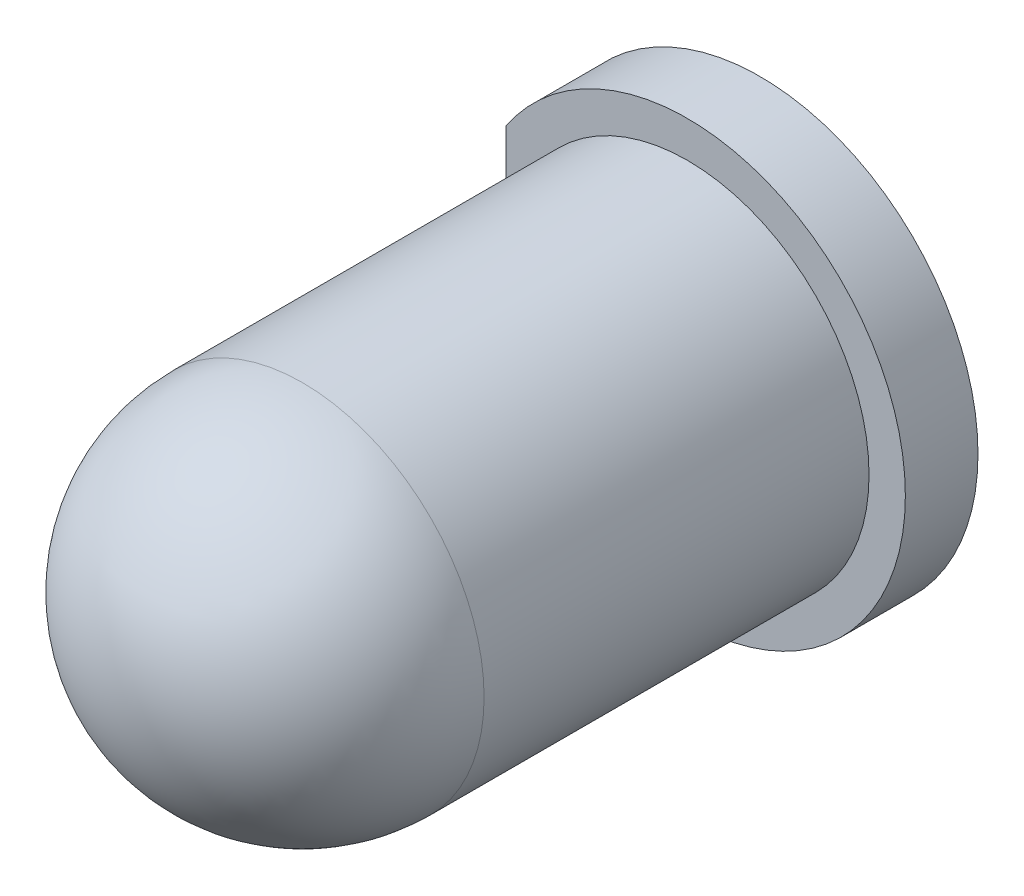
ISO-10303-21;
HEADER;
FILE_DESCRIPTION(('STEP AP214'),'2;1');
FILE_NAME('part.step','',(''),(''),'','','');
FILE_SCHEMA(('AUTOMOTIVE_DESIGN { 1 0 10303 214 1 1 1 1 }'));
ENDSEC;
DATA;
#1=APPLICATION_CONTEXT('core data for automotive mechanical design processes');
#2=APPLICATION_PROTOCOL_DEFINITION('international standard','automotive_design',2000,#1);
#3=PRODUCT_CONTEXT('',#1,'mechanical');
#4=PRODUCT('Part','Part','',(#3));
#5=PRODUCT_RELATED_PRODUCT_CATEGORY('part','',(#4));
#6=PRODUCT_DEFINITION_FORMATION('','',#4);
#7=PRODUCT_DEFINITION_CONTEXT('part definition',#1,'design');
#8=PRODUCT_DEFINITION('design','',#6,#7);
#9=PRODUCT_DEFINITION_SHAPE('','',#8);
#10=(LENGTH_UNIT() NAMED_UNIT(*) SI_UNIT(.MILLI.,.METRE.));
#11=(NAMED_UNIT(*) PLANE_ANGLE_UNIT() SI_UNIT($,.RADIAN.));
#12=(NAMED_UNIT(*) SI_UNIT($,.STERADIAN.) SOLID_ANGLE_UNIT());
#13=UNCERTAINTY_MEASURE_WITH_UNIT(LENGTH_MEASURE(1.E-05),#10,'distance_accuracy_value','');
#14=(GEOMETRIC_REPRESENTATION_CONTEXT(3) GLOBAL_UNCERTAINTY_ASSIGNED_CONTEXT((#13)) GLOBAL_UNIT_ASSIGNED_CONTEXT((#10,
#11,#12)) REPRESENTATION_CONTEXT('',''));
#15=CARTESIAN_POINT('',(0.,0.,0.));
#16=DIRECTION('',(0.,0.,1.));
#17=DIRECTION('',(1.,0.,0.));
#18=AXIS2_PLACEMENT_3D('',#15,#16,#17);
#19=CARTESIAN_POINT('',(-1.12,-0.24,0.));
#20=DIRECTION('',(1.,0.,0.));
#21=DIRECTION('',(0.,0.,-1.));
#22=AXIS2_PLACEMENT_3D('',#19,#20,#21);
#23=PLANE('',#22);
#24=DIRECTION('',(0.,1.,0.));
#25=VECTOR('',#24,1.);
#26=CARTESIAN_POINT('',(-1.12,-0.24,0.));
#27=LINE('',#26,#25);
#28=CARTESIAN_POINT('',(-1.12,-0.24,0.));
#29=VERTEX_POINT('',#28);
#30=CARTESIAN_POINT('',(-1.12,0.24,0.));
#31=VERTEX_POINT('',#30);
#32=EDGE_CURVE('E249',#29,#31,#27,.T.);
#33=ORIENTED_EDGE('',*,*,#32,.F.);
#34=DIRECTION('',(0.,0.,-1.));
#35=VECTOR('',#34,1.);
#36=CARTESIAN_POINT('',(-1.12,-0.24,0.));
#37=LINE('',#36,#35);
#38=CARTESIAN_POINT('',(-1.12,-0.24,2.));
#39=VERTEX_POINT('',#38);
#40=EDGE_CURVE('E236',#29,#39,#37,.F.);
#41=ORIENTED_EDGE('',*,*,#40,.T.);
#42=DIRECTION('',(0.,1.,0.));
#43=VECTOR('',#42,1.);
#44=CARTESIAN_POINT('',(-1.12,-0.24,2.));
#45=LINE('',#44,#43);
#46=CARTESIAN_POINT('',(-1.12,0.24,2.));
#47=VERTEX_POINT('',#46);
#48=EDGE_CURVE('E248',#39,#47,#45,.T.);
#49=ORIENTED_EDGE('',*,*,#48,.T.);
#50=DIRECTION('',(0.,0.,-1.));
#51=VECTOR('',#50,1.);
#52=CARTESIAN_POINT('',(-1.12,0.24,0.));
#53=LINE('',#52,#51);
#54=EDGE_CURVE('E216',#31,#47,#53,.F.);
#55=ORIENTED_EDGE('',*,*,#54,.F.);
#56=EDGE_LOOP('',(#33,#41,#49,#55));
#57=FACE_BOUND('',#56,.T.);
#58=ADVANCED_FACE('F17',(#57),#23,.F.);
#59=CARTESIAN_POINT('',(-1.12,-0.24,2.));
#60=DIRECTION('',(0.,0.,-1.));
#61=DIRECTION('',(-1.,0.,0.));
#62=AXIS2_PLACEMENT_3D('',#59,#60,#61);
#63=PLANE('',#62);
#64=ORIENTED_EDGE('',*,*,#48,.F.);
#65=DIRECTION('',(1.,0.,0.));
#66=VECTOR('',#65,1.);
#67=CARTESIAN_POINT('',(0.,-0.24,2.));
#68=LINE('',#67,#66);
#69=CARTESIAN_POINT('',(0.0199999999999998,-0.24,2.));
#70=VERTEX_POINT('',#69);
#71=EDGE_CURVE('E234',#39,#70,#68,.T.);
#72=ORIENTED_EDGE('',*,*,#71,.T.);
#73=DIRECTION('',(0.,1.,0.));
#74=VECTOR('',#73,1.);
#75=CARTESIAN_POINT('',(0.0199999999999998,-0.24,2.));
#76=LINE('',#75,#74);
#77=CARTESIAN_POINT('',(0.0199999999999998,0.24,2.));
#78=VERTEX_POINT('',#77);
#79=EDGE_CURVE('E246',#70,#78,#76,.T.);
#80=ORIENTED_EDGE('',*,*,#79,.T.);
#81=DIRECTION('',(1.,0.,0.));
#82=VECTOR('',#81,1.);
#83=CARTESIAN_POINT('',(0.,0.24,2.));
#84=LINE('',#83,#82);
#85=EDGE_CURVE('E213',#47,#78,#84,.T.);
#86=ORIENTED_EDGE('',*,*,#85,.F.);
#87=EDGE_LOOP('',(#64,#72,#80,#86));
#88=FACE_BOUND('',#87,.T.);
#89=ADVANCED_FACE('F284',(#88),#63,.F.);
#90=CARTESIAN_POINT('',(0.0199999999999998,-0.24,2.));
#91=DIRECTION('',(0.861269257590315,0.,-0.508148861978286));
#92=DIRECTION('',(-0.508148861978286,0.,-0.861269257590315));
#93=AXIS2_PLACEMENT_3D('',#90,#91,#92);
#94=PLANE('',#93);
#95=ORIENTED_EDGE('',*,*,#79,.F.);
#96=DIRECTION('',(0.508148861978286,0.,0.861269257590315));
#97=VECTOR('',#96,1.);
#98=CARTESIAN_POINT('',(0.0199999999999998,-0.24,2.));
#99=LINE('',#98,#97);
#100=CARTESIAN_POINT('',(1.2,-0.24,4.));
#101=VERTEX_POINT('',#100);
#102=EDGE_CURVE('E232',#70,#101,#99,.T.);
#103=ORIENTED_EDGE('',*,*,#102,.T.);
#104=DIRECTION('',(0.,1.,0.));
#105=VECTOR('',#104,1.);
#106=CARTESIAN_POINT('',(1.2,-0.24,4.));
#107=LINE('',#106,#105);
#108=CARTESIAN_POINT('',(1.2,0.24,4.));
#109=VERTEX_POINT('',#108);
#110=EDGE_CURVE('E244',#101,#109,#107,.T.);
#111=ORIENTED_EDGE('',*,*,#110,.T.);
#112=DIRECTION('',(0.508148861978286,0.,0.861269257590315));
#113=VECTOR('',#112,1.);
#114=CARTESIAN_POINT('',(0.0199999999999998,0.24,2.));
#115=LINE('',#114,#113);
#116=EDGE_CURVE('E210',#78,#109,#115,.T.);
#117=ORIENTED_EDGE('',*,*,#116,.F.);
#118=EDGE_LOOP('',(#95,#103,#111,#117));
#119=FACE_BOUND('',#118,.T.);
#120=ADVANCED_FACE('F281',(#119),#94,.F.);
#121=CARTESIAN_POINT('',(1.2,-0.24,4.));
#122=DIRECTION('',(0.,0.,1.));
#123=DIRECTION('',(1.,0.,0.));
#124=AXIS2_PLACEMENT_3D('',#121,#122,#123);
#125=PLANE('',#124);
#126=ORIENTED_EDGE('',*,*,#110,.F.);
#127=DIRECTION('',(1.,0.,0.));
#128=VECTOR('',#127,1.);
#129=CARTESIAN_POINT('',(0.,-0.24,4.));
#130=LINE('',#129,#128);
#131=CARTESIAN_POINT('',(-1.3,-0.24,4.));
#132=VERTEX_POINT('',#131);
#133=EDGE_CURVE('E230',#101,#132,#130,.F.);
#134=ORIENTED_EDGE('',*,*,#133,.T.);
#135=DIRECTION('',(0.,1.,0.));
#136=VECTOR('',#135,1.);
#137=CARTESIAN_POINT('',(-1.3,-0.24,4.));
#138=LINE('',#137,#136);
#139=CARTESIAN_POINT('',(-1.3,0.24,4.));
#140=VERTEX_POINT('',#139);
#141=EDGE_CURVE('E222',#132,#140,#138,.T.);
#142=ORIENTED_EDGE('',*,*,#141,.T.);
#143=DIRECTION('',(1.,0.,0.));
#144=VECTOR('',#143,1.);
#145=CARTESIAN_POINT('',(0.,0.24,4.));
#146=LINE('',#145,#144);
#147=EDGE_CURVE('E207',#109,#140,#146,.F.);
#148=ORIENTED_EDGE('',*,*,#147,.F.);
#149=EDGE_LOOP('',(#126,#134,#142,#148));
#150=FACE_BOUND('',#149,.T.);
#151=ADVANCED_FACE('F276',(#150),#125,.F.);
#152=CARTESIAN_POINT('',(1.6,-0.24,0.));
#153=DIRECTION('',(1.,0.,0.));
#154=DIRECTION('',(0.,0.,-1.));
#155=AXIS2_PLACEMENT_3D('',#152,#153,#154);
#156=PLANE('',#155);
#157=DIRECTION('',(0.,1.,0.));
#158=VECTOR('',#157,1.);
#159=CARTESIAN_POINT('',(1.6,-0.24,0.));
#160=LINE('',#159,#158);
#161=CARTESIAN_POINT('',(1.6,-0.24,0.));
#162=VERTEX_POINT('',#161);
#163=CARTESIAN_POINT('',(1.6,0.24,0.));
#164=VERTEX_POINT('',#163);
#165=EDGE_CURVE('E242',#162,#164,#160,.T.);
#166=ORIENTED_EDGE('',*,*,#165,.F.);
#167=DIRECTION('',(0.,0.,-1.));
#168=VECTOR('',#167,1.);
#169=CARTESIAN_POINT('',(1.6,-0.24,0.));
#170=LINE('',#169,#168);
#171=CARTESIAN_POINT('',(1.6,-0.24,4.));
#172=VERTEX_POINT('',#171);
#173=EDGE_CURVE('E202',#162,#172,#170,.F.);
#174=ORIENTED_EDGE('',*,*,#173,.T.);
#175=DIRECTION('',(0.,1.,0.));
#176=VECTOR('',#175,1.);
#177=CARTESIAN_POINT('',(1.6,-0.24,4.));
#178=LINE('',#177,#176);
#179=CARTESIAN_POINT('',(1.6,0.24,4.));
#180=VERTEX_POINT('',#179);
#181=EDGE_CURVE('E240',#172,#180,#178,.T.);
#182=ORIENTED_EDGE('',*,*,#181,.T.);
#183=DIRECTION('',(0.,0.,-1.));
#184=VECTOR('',#183,1.);
#185=CARTESIAN_POINT('',(1.6,0.24,0.));
#186=LINE('',#185,#184);
#187=EDGE_CURVE('E184',#164,#180,#186,.F.);
#188=ORIENTED_EDGE('',*,*,#187,.F.);
#189=EDGE_LOOP('',(#166,#174,#182,#188));
#190=FACE_BOUND('',#189,.T.);
#191=ADVANCED_FACE('F343',(#190),#156,.F.);
#192=CARTESIAN_POINT('',(1.6,-0.24,4.));
#193=DIRECTION('',(0.,0.,1.));
#194=DIRECTION('',(1.,0.,0.));
#195=AXIS2_PLACEMENT_3D('',#192,#193,#194);
#196=PLANE('',#195);
#197=ORIENTED_EDGE('',*,*,#181,.F.);
#198=DIRECTION('',(1.,0.,0.));
#199=VECTOR('',#198,1.);
#200=CARTESIAN_POINT('',(0.,-0.24,4.));
#201=LINE('',#200,#199);
#202=CARTESIAN_POINT('',(1.4,-0.24,4.));
#203=VERTEX_POINT('',#202);
#204=EDGE_CURVE('E200',#172,#203,#201,.F.);
#205=ORIENTED_EDGE('',*,*,#204,.T.);
#206=DIRECTION('',(0.,1.,0.));
#207=VECTOR('',#206,1.);
#208=CARTESIAN_POINT('',(1.4,-0.24,4.));
#209=LINE('',#208,#207);
#210=CARTESIAN_POINT('',(1.4,0.24,4.));
#211=VERTEX_POINT('',#210);
#212=EDGE_CURVE('E238',#203,#211,#209,.T.);
#213=ORIENTED_EDGE('',*,*,#212,.T.);
#214=DIRECTION('',(1.,0.,0.));
#215=VECTOR('',#214,1.);
#216=CARTESIAN_POINT('',(0.,0.24,4.));
#217=LINE('',#216,#215);
#218=EDGE_CURVE('E181',#180,#211,#217,.F.);
#219=ORIENTED_EDGE('',*,*,#218,.F.);
#220=EDGE_LOOP('',(#197,#205,#213,#219));
#221=FACE_BOUND('',#220,.T.);
#222=ADVANCED_FACE('F339',(#221),#196,.F.);
#223=CARTESIAN_POINT('',(1.4,-0.24,4.));
#224=DIRECTION('',(-0.861269257590315,0.,0.508148861978286));
#225=DIRECTION('',(0.508148861978286,0.,0.861269257590315));
#226=AXIS2_PLACEMENT_3D('',#223,#224,#225);
#227=PLANE('',#226);
#228=ORIENTED_EDGE('',*,*,#212,.F.);
#229=DIRECTION('',(-0.508148861978286,0.,-0.861269257590315));
#230=VECTOR('',#229,1.);
#231=CARTESIAN_POINT('',(1.4,-0.24,4.));
#232=LINE('',#231,#230);
#233=CARTESIAN_POINT('',(0.22,-0.24,2.));
#234=VERTEX_POINT('',#233);
#235=EDGE_CURVE('E198',#203,#234,#232,.T.);
#236=ORIENTED_EDGE('',*,*,#235,.T.);
#237=DIRECTION('',(0.,1.,0.));
#238=VECTOR('',#237,1.);
#239=CARTESIAN_POINT('',(0.22,-0.24,2.));
#240=LINE('',#239,#238);
#241=CARTESIAN_POINT('',(0.22,0.24,2.));
#242=VERTEX_POINT('',#241);
#243=EDGE_CURVE('E190',#234,#242,#240,.T.);
#244=ORIENTED_EDGE('',*,*,#243,.T.);
#245=DIRECTION('',(-0.508148861978286,0.,-0.861269257590315));
#246=VECTOR('',#245,1.);
#247=CARTESIAN_POINT('',(1.4,0.24,4.));
#248=LINE('',#247,#246);
#249=EDGE_CURVE('E178',#211,#242,#248,.T.);
#250=ORIENTED_EDGE('',*,*,#249,.F.);
#251=EDGE_LOOP('',(#228,#236,#244,#250));
#252=FACE_BOUND('',#251,.T.);
#253=ADVANCED_FACE('F336',(#252),#227,.F.);
#254=CARTESIAN_POINT('',(0.,-0.24,0.));
#255=DIRECTION('',(0.,-1.,0.));
#256=DIRECTION('',(0.,0.,-1.));
#257=AXIS2_PLACEMENT_3D('',#254,#255,#256);
#258=PLANE('',#257);
#259=DIRECTION('',(0.,0.,1.));
#260=VECTOR('',#259,1.);
#261=CARTESIAN_POINT('',(-1.6,-0.24,0.));
#262=LINE('',#261,#260);
#263=CARTESIAN_POINT('',(-1.6,-0.24,0.));
#264=VERTEX_POINT('',#263);
#265=CARTESIAN_POINT('',(-1.6,-0.24,3.5));
#266=VERTEX_POINT('',#265);
#267=EDGE_CURVE('E173',#264,#266,#262,.T.);
#268=ORIENTED_EDGE('',*,*,#267,.T.);
#269=DIRECTION('',(0.514495755427526,0.,0.857492925712544));
#270=VECTOR('',#269,1.);
#271=CARTESIAN_POINT('',(-1.3,-0.24,4.));
#272=LINE('',#271,#270);
#273=EDGE_CURVE('E224',#266,#132,#272,.T.);
#274=ORIENTED_EDGE('',*,*,#273,.T.);
#275=ORIENTED_EDGE('',*,*,#133,.F.);
#276=ORIENTED_EDGE('',*,*,#102,.F.);
#277=ORIENTED_EDGE('',*,*,#71,.F.);
#278=ORIENTED_EDGE('',*,*,#40,.F.);
#279=DIRECTION('',(1.,0.,0.));
#280=VECTOR('',#279,1.);
#281=CARTESIAN_POINT('',(0.,-0.24,0.));
#282=LINE('',#281,#280);
#283=EDGE_CURVE('E227',#264,#29,#282,.T.);
#284=ORIENTED_EDGE('',*,*,#283,.F.);
#285=EDGE_LOOP('',(#268,#274,#275,#276,#277,#278,#284));
#286=FACE_BOUND('',#285,.T.);
#287=ADVANCED_FACE('F268',(#286),#258,.F.);
#288=CARTESIAN_POINT('',(-1.3,-0.24,4.));
#289=DIRECTION('',(-0.857492925712544,0.,0.514495755427526));
#290=DIRECTION('',(0.514495755427526,0.,0.857492925712544));
#291=AXIS2_PLACEMENT_3D('',#288,#289,#290);
#292=PLANE('',#291);
#293=ORIENTED_EDGE('',*,*,#141,.F.);
#294=ORIENTED_EDGE('',*,*,#273,.F.);
#295=DIRECTION('',(0.,1.,0.));
#296=VECTOR('',#295,1.);
#297=CARTESIAN_POINT('',(-1.6,-0.24,3.5));
#298=LINE('',#297,#296);
#299=CARTESIAN_POINT('',(-1.6,0.24,3.5));
#300=VERTEX_POINT('',#299);
#301=EDGE_CURVE('E171',#266,#300,#298,.T.);
#302=ORIENTED_EDGE('',*,*,#301,.T.);
#303=DIRECTION('',(-0.514495755427526,0.,-0.857492925712544));
#304=VECTOR('',#303,1.);
#305=CARTESIAN_POINT('',(-1.3,0.24,4.));
#306=LINE('',#305,#304);
#307=EDGE_CURVE('E204',#140,#300,#306,.T.);
#308=ORIENTED_EDGE('',*,*,#307,.F.);
#309=EDGE_LOOP('',(#293,#294,#302,#308));
#310=FACE_BOUND('',#309,.T.);
#311=ADVANCED_FACE('F272',(#310),#292,.F.);
#312=CARTESIAN_POINT('',(0.,0.24,0.));
#313=DIRECTION('',(0.,-1.,0.));
#314=DIRECTION('',(0.,0.,-1.));
#315=AXIS2_PLACEMENT_3D('',#312,#313,#314);
#316=PLANE('',#315);
#317=ORIENTED_EDGE('',*,*,#307,.T.);
#318=DIRECTION('',(0.,0.,1.));
#319=VECTOR('',#318,1.);
#320=CARTESIAN_POINT('',(-1.6,0.24,0.));
#321=LINE('',#320,#319);
#322=CARTESIAN_POINT('',(-1.6,0.24,0.));
#323=VERTEX_POINT('',#322);
#324=EDGE_CURVE('E168',#300,#323,#321,.F.);
#325=ORIENTED_EDGE('',*,*,#324,.T.);
#326=DIRECTION('',(1.,0.,0.));
#327=VECTOR('',#326,1.);
#328=CARTESIAN_POINT('',(0.,0.24,0.));
#329=LINE('',#328,#327);
#330=EDGE_CURVE('E219',#323,#31,#329,.T.);
#331=ORIENTED_EDGE('',*,*,#330,.T.);
#332=ORIENTED_EDGE('',*,*,#54,.T.);
#333=ORIENTED_EDGE('',*,*,#85,.T.);
#334=ORIENTED_EDGE('',*,*,#116,.T.);
#335=ORIENTED_EDGE('',*,*,#147,.T.);
#336=EDGE_LOOP('',(#317,#325,#331,#332,#333,#334,#335));
#337=FACE_BOUND('',#336,.T.);
#338=ADVANCED_FACE('F259',(#337),#316,.T.);
#339=CARTESIAN_POINT('',(0.,-0.24,0.));
#340=DIRECTION('',(0.,-1.,0.));
#341=DIRECTION('',(0.,0.,-1.));
#342=AXIS2_PLACEMENT_3D('',#339,#340,#341);
#343=PLANE('',#342);
#344=DIRECTION('',(0.,0.,1.));
#345=VECTOR('',#344,1.);
#346=CARTESIAN_POINT('',(1.12,-0.24,2.));
#347=LINE('',#346,#345);
#348=CARTESIAN_POINT('',(1.12,-0.24,0.));
#349=VERTEX_POINT('',#348);
#350=CARTESIAN_POINT('',(1.12,-0.24,2.));
#351=VERTEX_POINT('',#350);
#352=EDGE_CURVE('E166',#349,#351,#347,.T.);
#353=ORIENTED_EDGE('',*,*,#352,.T.);
#354=DIRECTION('',(-1.,0.,0.));
#355=VECTOR('',#354,1.);
#356=CARTESIAN_POINT('',(0.22,-0.24,2.));
#357=LINE('',#356,#355);
#358=EDGE_CURVE('E192',#351,#234,#357,.T.);
#359=ORIENTED_EDGE('',*,*,#358,.T.);
#360=ORIENTED_EDGE('',*,*,#235,.F.);
#361=ORIENTED_EDGE('',*,*,#204,.F.);
#362=ORIENTED_EDGE('',*,*,#173,.F.);
#363=DIRECTION('',(1.,0.,0.));
#364=VECTOR('',#363,1.);
#365=CARTESIAN_POINT('',(0.,-0.24,0.));
#366=LINE('',#365,#364);
#367=EDGE_CURVE('E195',#349,#162,#366,.T.);
#368=ORIENTED_EDGE('',*,*,#367,.F.);
#369=EDGE_LOOP('',(#353,#359,#360,#361,#362,#368));
#370=FACE_BOUND('',#369,.T.);
#371=ADVANCED_FACE('F325',(#370),#343,.F.);
#372=CARTESIAN_POINT('',(0.22,-0.24,2.));
#373=DIRECTION('',(0.,0.,-1.));
#374=DIRECTION('',(-1.,0.,0.));
#375=AXIS2_PLACEMENT_3D('',#372,#373,#374);
#376=PLANE('',#375);
#377=ORIENTED_EDGE('',*,*,#243,.F.);
#378=ORIENTED_EDGE('',*,*,#358,.F.);
#379=DIRECTION('',(0.,1.,0.));
#380=VECTOR('',#379,1.);
#381=CARTESIAN_POINT('',(1.12,-0.24,2.));
#382=LINE('',#381,#380);
#383=CARTESIAN_POINT('',(1.12,0.24,2.));
#384=VERTEX_POINT('',#383);
#385=EDGE_CURVE('E164',#351,#384,#382,.T.);
#386=ORIENTED_EDGE('',*,*,#385,.T.);
#387=DIRECTION('',(1.,0.,0.));
#388=VECTOR('',#387,1.);
#389=CARTESIAN_POINT('',(0.,0.24,2.));
#390=LINE('',#389,#388);
#391=EDGE_CURVE('E175',#242,#384,#390,.T.);
#392=ORIENTED_EDGE('',*,*,#391,.F.);
#393=EDGE_LOOP('',(#377,#378,#386,#392));
#394=FACE_BOUND('',#393,.T.);
#395=ADVANCED_FACE('F321',(#394),#376,.F.);
#396=CARTESIAN_POINT('',(0.,0.24,0.));
#397=DIRECTION('',(0.,-1.,0.));
#398=DIRECTION('',(0.,0.,-1.));
#399=AXIS2_PLACEMENT_3D('',#396,#397,#398);
#400=PLANE('',#399);
#401=ORIENTED_EDGE('',*,*,#391,.T.);
#402=DIRECTION('',(0.,0.,1.));
#403=VECTOR('',#402,1.);
#404=CARTESIAN_POINT('',(1.12,0.24,2.));
#405=LINE('',#404,#403);
#406=CARTESIAN_POINT('',(1.12,0.24,0.));
#407=VERTEX_POINT('',#406);
#408=EDGE_CURVE('E135',#384,#407,#405,.F.);
#409=ORIENTED_EDGE('',*,*,#408,.T.);
#410=DIRECTION('',(1.,0.,0.));
#411=VECTOR('',#410,1.);
#412=CARTESIAN_POINT('',(0.,0.24,0.));
#413=LINE('',#412,#411);
#414=EDGE_CURVE('E187',#407,#164,#413,.T.);
#415=ORIENTED_EDGE('',*,*,#414,.T.);
#416=ORIENTED_EDGE('',*,*,#187,.T.);
#417=ORIENTED_EDGE('',*,*,#218,.T.);
#418=ORIENTED_EDGE('',*,*,#249,.T.);
#419=EDGE_LOOP('',(#401,#409,#415,#416,#417,#418));
#420=FACE_BOUND('',#419,.T.);
#421=ADVANCED_FACE('F318',(#420),#400,.T.);
#422=CARTESIAN_POINT('',(-1.6,-0.24,0.));
#423=DIRECTION('',(-1.,0.,0.));
#424=DIRECTION('',(0.,0.,1.));
#425=AXIS2_PLACEMENT_3D('',#422,#423,#424);
#426=PLANE('',#425);
#427=ORIENTED_EDGE('',*,*,#301,.F.);
#428=ORIENTED_EDGE('',*,*,#267,.F.);
#429=DIRECTION('',(0.,1.,0.));
#430=VECTOR('',#429,1.);
#431=CARTESIAN_POINT('',(-1.6,0.,0.));
#432=LINE('',#431,#430);
#433=EDGE_CURVE('E142',#264,#323,#432,.T.);
#434=ORIENTED_EDGE('',*,*,#433,.T.);
#435=ORIENTED_EDGE('',*,*,#324,.F.);
#436=EDGE_LOOP('',(#427,#428,#434,#435));
#437=FACE_BOUND('',#436,.T.);
#438=ADVANCED_FACE('F265',(#437),#426,.F.);
#439=CARTESIAN_POINT('',(1.12,-0.24,2.));
#440=DIRECTION('',(-1.,0.,0.));
#441=DIRECTION('',(0.,0.,1.));
#442=AXIS2_PLACEMENT_3D('',#439,#440,#441);
#443=PLANE('',#442);
#444=ORIENTED_EDGE('',*,*,#385,.F.);
#445=ORIENTED_EDGE('',*,*,#352,.F.);
#446=DIRECTION('',(0.,1.,0.));
#447=VECTOR('',#446,1.);
#448=CARTESIAN_POINT('',(1.12,0.,0.));
#449=LINE('',#448,#447);
#450=EDGE_CURVE('E151',#349,#407,#449,.T.);
#451=ORIENTED_EDGE('',*,*,#450,.T.);
#452=ORIENTED_EDGE('',*,*,#408,.F.);
#453=EDGE_LOOP('',(#444,#445,#451,#452));
#454=FACE_BOUND('',#453,.T.);
#455=ADVANCED_FACE('F312',(#454),#443,.F.);
#456=CARTESIAN_POINT('',(-2.5,1.6583123951777,4.35410196624969));
#457=DIRECTION('',(1.,0.,0.));
#458=DIRECTION('',(0.,0.,-1.));
#459=AXIS2_PLACEMENT_3D('',#456,#457,#458);
#460=PLANE('',#459);
#461=DIRECTION('',(0.,1.,0.));
#462=VECTOR('',#461,1.);
#463=CARTESIAN_POINT('',(-2.5,0.,0.));
#464=LINE('',#463,#462);
#465=CARTESIAN_POINT('',(-2.5,1.6583123951777,0.));
#466=VERTEX_POINT('',#465);
#467=CARTESIAN_POINT('',(-2.5,-1.6583123951777,0.));
#468=VERTEX_POINT('',#467);
#469=EDGE_CURVE('E150',#466,#468,#464,.F.);
#470=ORIENTED_EDGE('',*,*,#469,.T.);
#471=DIRECTION('',(0.,0.,-1.));
#472=VECTOR('',#471,1.);
#473=CARTESIAN_POINT('',(-2.5,-1.6583123951777,4.35410196624969));
#474=LINE('',#473,#472);
#475=CARTESIAN_POINT('',(-2.5,-1.6583123951777,1.));
#476=VERTEX_POINT('',#475);
#477=EDGE_CURVE('E134',#476,#468,#474,.T.);
#478=ORIENTED_EDGE('',*,*,#477,.F.);
#479=DIRECTION('',(0.,1.,0.));
#480=VECTOR('',#479,1.);
#481=CARTESIAN_POINT('',(-2.5,0.,1.));
#482=LINE('',#481,#480);
#483=CARTESIAN_POINT('',(-2.5,1.6583123951777,1.));
#484=VERTEX_POINT('',#483);
#485=EDGE_CURVE('E20',#484,#476,#482,.F.);
#486=ORIENTED_EDGE('',*,*,#485,.F.);
#487=DIRECTION('',(0.,0.,-1.));
#488=VECTOR('',#487,1.);
#489=CARTESIAN_POINT('',(-2.5,1.6583123951777,4.35410196624969));
#490=LINE('',#489,#488);
#491=EDGE_CURVE('E132',#466,#484,#490,.F.);
#492=ORIENTED_EDGE('',*,*,#491,.F.);
#493=EDGE_LOOP('',(#470,#478,#486,#492));
#494=FACE_BOUND('',#493,.T.);
#495=ADVANCED_FACE('F131',(#494),#460,.F.);
#496=CARTESIAN_POINT('',(0.,0.,0.));
#497=DIRECTION('',(0.,0.,1.));
#498=DIRECTION('',(1.,0.,0.));
#499=AXIS2_PLACEMENT_3D('',#496,#497,#498);
#500=PLANE('',#499);
#501=ORIENTED_EDGE('',*,*,#469,.F.);
#502=CARTESIAN_POINT('',(0.,0.,0.));
#503=DIRECTION('',(0.,0.,-1.));
#504=DIRECTION('',(-1.,0.,0.));
#505=AXIS2_PLACEMENT_3D('',#502,#503,#504);
#506=CIRCLE('',#505,3.);
#507=EDGE_CURVE('E141',#468,#466,#506,.F.);
#508=ORIENTED_EDGE('',*,*,#507,.F.);
#509=EDGE_LOOP('',(#501,#508));
#510=FACE_BOUND('',#509,.T.);
#511=ORIENTED_EDGE('',*,*,#367,.T.);
#512=ORIENTED_EDGE('',*,*,#165,.T.);
#513=ORIENTED_EDGE('',*,*,#414,.F.);
#514=ORIENTED_EDGE('',*,*,#450,.F.);
#515=EDGE_LOOP('',(#511,#512,#513,#514));
#516=FACE_BOUND('',#515,.T.);
#517=ORIENTED_EDGE('',*,*,#283,.T.);
#518=ORIENTED_EDGE('',*,*,#32,.T.);
#519=ORIENTED_EDGE('',*,*,#330,.F.);
#520=ORIENTED_EDGE('',*,*,#433,.F.);
#521=EDGE_LOOP('',(#517,#518,#519,#520));
#522=FACE_BOUND('',#521,.T.);
#523=ADVANCED_FACE('F252',(#510,#516,#522),#500,.F.);
#524=CARTESIAN_POINT('',(0.,0.,1.));
#525=DIRECTION('',(0.,0.,-1.));
#526=DIRECTION('',(-1.,0.,0.));
#527=AXIS2_PLACEMENT_3D('',#524,#525,#526);
#528=CYLINDRICAL_SURFACE('',#527,3.);
#529=ORIENTED_EDGE('',*,*,#507,.T.);
#530=ORIENTED_EDGE('',*,*,#491,.T.);
#531=CARTESIAN_POINT('',(0.,0.,1.));
#532=DIRECTION('',(0.,0.,-1.));
#533=DIRECTION('',(-1.,0.,0.));
#534=AXIS2_PLACEMENT_3D('',#531,#532,#533);
#535=CIRCLE('',#534,3.);
#536=EDGE_CURVE('E139',#476,#484,#535,.F.);
#537=ORIENTED_EDGE('',*,*,#536,.F.);
#538=ORIENTED_EDGE('',*,*,#477,.T.);
#539=EDGE_LOOP('',(#529,#530,#537,#538));
#540=FACE_BOUND('',#539,.T.);
#541=ADVANCED_FACE('F138',(#540),#528,.T.);
#542=CARTESIAN_POINT('',(0.,0.,6.3));
#543=DIRECTION('',(0.,1.,0.));
#544=DIRECTION('',(0.,0.,1.));
#545=AXIS2_PLACEMENT_3D('',#542,#543,#544);
#546=SPHERICAL_SURFACE('',#545,2.5);
#547=CARTESIAN_POINT('',(0.,0.,6.3));
#548=DIRECTION('',(0.,0.,-1.));
#549=DIRECTION('',(0.,1.,0.));
#550=AXIS2_PLACEMENT_3D('',#547,#548,#549);
#551=CIRCLE('',#550,2.5);
#552=CARTESIAN_POINT('',(0.,-2.5,6.3));
#553=VERTEX_POINT('',#552);
#554=CARTESIAN_POINT('',(0.,2.5,6.3));
#555=VERTEX_POINT('',#554);
#556=EDGE_CURVE('E26',#553,#555,#551,.T.);
#557=ORIENTED_EDGE('',*,*,#556,.F.);
#558=CARTESIAN_POINT('',(0.,0.,6.3));
#559=DIRECTION('',(0.,0.,-1.));
#560=DIRECTION('',(0.,1.,0.));
#561=AXIS2_PLACEMENT_3D('',#558,#559,#560);
#562=CIRCLE('',#561,2.5);
#563=EDGE_CURVE('E34',#555,#553,#562,.T.);
#564=ORIENTED_EDGE('',*,*,#563,.F.);
#565=EDGE_LOOP('',(#557,#564));
#566=FACE_BOUND('',#565,.T.);
#567=ADVANCED_FACE('F299',(#566),#546,.T.);
#568=CARTESIAN_POINT('',(0.,0.,1.));
#569=DIRECTION('',(0.,0.,1.));
#570=DIRECTION('',(1.,0.,0.));
#571=AXIS2_PLACEMENT_3D('',#568,#569,#570);
#572=PLANE('',#571);
#573=ORIENTED_EDGE('',*,*,#536,.T.);
#574=ORIENTED_EDGE('',*,*,#485,.T.);
#575=EDGE_LOOP('',(#573,#574));
#576=FACE_BOUND('',#575,.T.);
#577=CARTESIAN_POINT('',(0.,0.,0.999999999999999));
#578=DIRECTION('',(0.,0.,-1.));
#579=DIRECTION('',(0.,1.,0.));
#580=AXIS2_PLACEMENT_3D('',#577,#578,#579);
#581=CIRCLE('',#580,2.5);
#582=CARTESIAN_POINT('',(0.,2.5,1.));
#583=VERTEX_POINT('',#582);
#584=EDGE_CURVE('E11',#583,#583,#581,.F.);
#585=ORIENTED_EDGE('',*,*,#584,.F.);
#586=EDGE_LOOP('',(#585));
#587=FACE_BOUND('',#586,.T.);
#588=ADVANCED_FACE('F144',(#576,#587),#572,.T.);
#589=CARTESIAN_POINT('',(0.,0.,1.));
#590=DIRECTION('',(0.,0.,-1.));
#591=DIRECTION('',(0.,1.,0.));
#592=AXIS2_PLACEMENT_3D('',#589,#590,#591);
#593=CYLINDRICAL_SURFACE('',#592,2.5);
#594=ORIENTED_EDGE('',*,*,#563,.T.);
#595=ORIENTED_EDGE('',*,*,#556,.T.);
#596=EDGE_LOOP('',(#594,#595));
#597=FACE_BOUND('',#596,.T.);
#598=ORIENTED_EDGE('',*,*,#584,.T.);
#599=EDGE_LOOP('',(#598));
#600=FACE_BOUND('',#599,.T.);
#601=ADVANCED_FACE('F292',(#597,#600),#593,.T.);
#602=CLOSED_SHELL('',(#58,#89,#120,#151,#191,#222,#253,#287,#311,#338,#371,#395,#421,#438,#455,
#495,#523,#541,#567,#588,#601));
#603=MANIFOLD_SOLID_BREP('B1',#602);
#604=ADVANCED_BREP_SHAPE_REPRESENTATION('',(#18,#603),#14);
#605=SHAPE_DEFINITION_REPRESENTATION(#9,#604);
ENDSEC;
END-ISO-10303-21;
